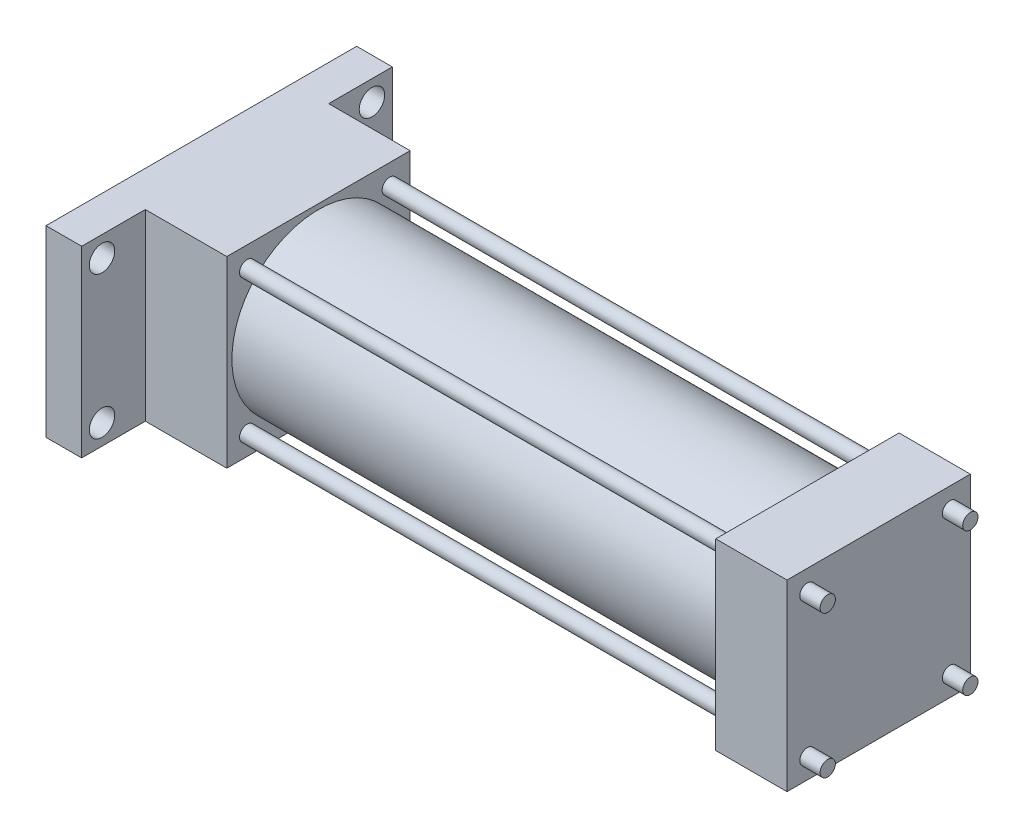
ISO-10303-21;
HEADER;
FILE_DESCRIPTION(('STEP AP214'),'2;1');
FILE_NAME('part.step','',(''),(''),'','','');
FILE_SCHEMA(('AUTOMOTIVE_DESIGN { 1 0 10303 214 1 1 1 1 }'));
ENDSEC;
DATA;
#1=APPLICATION_CONTEXT('core data for automotive mechanical design processes');
#2=APPLICATION_PROTOCOL_DEFINITION('international standard','automotive_design',2000,#1);
#3=PRODUCT_CONTEXT('',#1,'mechanical');
#4=PRODUCT('Part','Part','',(#3));
#5=PRODUCT_RELATED_PRODUCT_CATEGORY('part','',(#4));
#6=PRODUCT_DEFINITION_FORMATION('','',#4);
#7=PRODUCT_DEFINITION_CONTEXT('part definition',#1,'design');
#8=PRODUCT_DEFINITION('design','',#6,#7);
#9=PRODUCT_DEFINITION_SHAPE('','',#8);
#10=(LENGTH_UNIT() NAMED_UNIT(*) SI_UNIT(.MILLI.,.METRE.));
#11=(NAMED_UNIT(*) PLANE_ANGLE_UNIT() SI_UNIT($,.RADIAN.));
#12=(NAMED_UNIT(*) SI_UNIT($,.STERADIAN.) SOLID_ANGLE_UNIT());
#13=UNCERTAINTY_MEASURE_WITH_UNIT(LENGTH_MEASURE(1.E-05),#10,'distance_accuracy_value','');
#14=(GEOMETRIC_REPRESENTATION_CONTEXT(3) GLOBAL_UNCERTAINTY_ASSIGNED_CONTEXT((#13)) GLOBAL_UNIT_ASSIGNED_CONTEXT((#10,
#11,#12)) REPRESENTATION_CONTEXT('',''));
#15=CARTESIAN_POINT('',(0.,0.,0.));
#16=DIRECTION('',(0.,0.,1.));
#17=DIRECTION('',(1.,0.,0.));
#18=AXIS2_PLACEMENT_3D('',#15,#16,#17);
#19=CARTESIAN_POINT('',(-422.275,-57.15,57.1500000000001));
#20=DIRECTION('',(0.,0.,-1.));
#21=DIRECTION('',(0.,1.,0.));
#22=AXIS2_PLACEMENT_3D('',#19,#20,#21);
#23=PLANE('',#22);
#24=DIRECTION('',(0.,1.,0.));
#25=VECTOR('',#24,1.);
#26=CARTESIAN_POINT('',(-400.05,-57.15,57.1500000000001));
#27=LINE('',#26,#25);
#28=CARTESIAN_POINT('',(-400.05,-57.1499999999999,57.15));
#29=VERTEX_POINT('',#28);
#30=CARTESIAN_POINT('',(-400.05,57.15,57.15));
#31=VERTEX_POINT('',#30);
#32=EDGE_CURVE('E174',#29,#31,#27,.T.);
#33=ORIENTED_EDGE('',*,*,#32,.F.);
#34=DIRECTION('',(1.,0.,0.));
#35=VECTOR('',#34,1.);
#36=CARTESIAN_POINT('',(-422.275,-57.15,57.1500000000001));
#37=LINE('',#36,#35);
#38=CARTESIAN_POINT('',(-349.25,-57.15,57.1500000000001));
#39=VERTEX_POINT('',#38);
#40=EDGE_CURVE('E249',#29,#39,#37,.T.);
#41=ORIENTED_EDGE('',*,*,#40,.T.);
#42=DIRECTION('',(0.,1.,0.));
#43=VECTOR('',#42,1.);
#44=CARTESIAN_POINT('',(-349.25,-57.15,57.1500000000001));
#45=LINE('',#44,#43);
#46=CARTESIAN_POINT('',(-349.25,57.15,57.15));
#47=VERTEX_POINT('',#46);
#48=EDGE_CURVE('E238',#39,#47,#45,.T.);
#49=ORIENTED_EDGE('',*,*,#48,.T.);
#50=DIRECTION('',(1.,0.,0.));
#51=VECTOR('',#50,1.);
#52=CARTESIAN_POINT('',(-422.275,57.15,57.15));
#53=LINE('',#52,#51);
#54=EDGE_CURVE('E247',#31,#47,#53,.T.);
#55=ORIENTED_EDGE('',*,*,#54,.F.);
#56=EDGE_LOOP('',(#33,#41,#49,#55));
#57=FACE_BOUND('',#56,.T.);
#58=ADVANCED_FACE('F37',(#57),#23,.F.);
#59=CARTESIAN_POINT('',(-422.275,57.15,-57.15));
#60=DIRECTION('',(0.,0.,1.));
#61=DIRECTION('',(0.,-1.,0.));
#62=AXIS2_PLACEMENT_3D('',#59,#60,#61);
#63=PLANE('',#62);
#64=DIRECTION('',(0.,-1.,0.));
#65=VECTOR('',#64,1.);
#66=CARTESIAN_POINT('',(-400.05,57.15,-57.15));
#67=LINE('',#66,#65);
#68=CARTESIAN_POINT('',(-400.05,57.15,-57.15));
#69=VERTEX_POINT('',#68);
#70=CARTESIAN_POINT('',(-400.05,-57.1499999999999,-57.15));
#71=VERTEX_POINT('',#70);
#72=EDGE_CURVE('E167',#69,#71,#67,.T.);
#73=ORIENTED_EDGE('',*,*,#72,.F.);
#74=DIRECTION('',(1.,0.,0.));
#75=VECTOR('',#74,1.);
#76=CARTESIAN_POINT('',(-422.275,57.15,-57.15));
#77=LINE('',#76,#75);
#78=CARTESIAN_POINT('',(-349.25,57.15,-57.15));
#79=VERTEX_POINT('',#78);
#80=EDGE_CURVE('E145',#69,#79,#77,.T.);
#81=ORIENTED_EDGE('',*,*,#80,.T.);
#82=DIRECTION('',(0.,-1.,0.));
#83=VECTOR('',#82,1.);
#84=CARTESIAN_POINT('',(-349.25,57.15,-57.15));
#85=LINE('',#84,#83);
#86=CARTESIAN_POINT('',(-349.25,-57.15,-57.15));
#87=VERTEX_POINT('',#86);
#88=EDGE_CURVE('E233',#79,#87,#85,.T.);
#89=ORIENTED_EDGE('',*,*,#88,.T.);
#90=DIRECTION('',(1.,0.,0.));
#91=VECTOR('',#90,1.);
#92=CARTESIAN_POINT('',(-422.275,-57.15,-57.15));
#93=LINE('',#92,#91);
#94=EDGE_CURVE('E235',#71,#87,#93,.T.);
#95=ORIENTED_EDGE('',*,*,#94,.F.);
#96=EDGE_LOOP('',(#73,#81,#89,#95));
#97=FACE_BOUND('',#96,.T.);
#98=ADVANCED_FACE('F327',(#97),#63,.F.);
#99=CARTESIAN_POINT('',(-44.45,-57.15,57.1500000000001));
#100=DIRECTION('',(-1.,0.,0.));
#101=DIRECTION('',(0.,0.,1.));
#102=AXIS2_PLACEMENT_3D('',#99,#100,#101);
#103=PLANE('',#102);
#104=CARTESIAN_POINT('',(-44.45,-44.45,44.45));
#105=DIRECTION('',(-1.,0.,0.));
#106=DIRECTION('',(0.,0.,1.));
#107=AXIS2_PLACEMENT_3D('',#104,#105,#106);
#108=CIRCLE('',#107,4.7625);
#109=CARTESIAN_POINT('',(-44.45,-44.45,49.2125));
#110=VERTEX_POINT('',#109);
#111=EDGE_CURVE('E47',#110,#110,#108,.T.);
#112=ORIENTED_EDGE('',*,*,#111,.F.);
#113=EDGE_LOOP('',(#112));
#114=FACE_BOUND('',#113,.T.);
#115=CARTESIAN_POINT('',(-44.45,44.45,44.45));
#116=DIRECTION('',(-1.,0.,0.));
#117=DIRECTION('',(0.,0.,1.));
#118=AXIS2_PLACEMENT_3D('',#115,#116,#117);
#119=CIRCLE('',#118,4.7625);
#120=CARTESIAN_POINT('',(-44.45,44.45,49.2125));
#121=VERTEX_POINT('',#120);
#122=EDGE_CURVE('E213',#121,#121,#119,.F.);
#123=ORIENTED_EDGE('',*,*,#122,.T.);
#124=EDGE_LOOP('',(#123));
#125=FACE_BOUND('',#124,.T.);
#126=DIRECTION('',(0.,-1.,0.));
#127=VECTOR('',#126,1.);
#128=CARTESIAN_POINT('',(-44.45,57.15,57.15));
#129=LINE('',#128,#127);
#130=CARTESIAN_POINT('',(-44.45,57.15,57.15));
#131=VERTEX_POINT('',#130);
#132=CARTESIAN_POINT('',(-44.45,-57.15,57.1500000000001));
#133=VERTEX_POINT('',#132);
#134=EDGE_CURVE('E258',#131,#133,#129,.T.);
#135=ORIENTED_EDGE('',*,*,#134,.F.);
#136=DIRECTION('',(0.,0.,-1.));
#137=VECTOR('',#136,1.);
#138=CARTESIAN_POINT('',(-44.45,57.15,57.15));
#139=LINE('',#138,#137);
#140=CARTESIAN_POINT('',(-44.45,57.15,-57.15));
#141=VERTEX_POINT('',#140);
#142=EDGE_CURVE('E264',#131,#141,#139,.T.);
#143=ORIENTED_EDGE('',*,*,#142,.T.);
#144=DIRECTION('',(0.,1.,0.));
#145=VECTOR('',#144,1.);
#146=CARTESIAN_POINT('',(-44.45,-57.15,-57.15));
#147=LINE('',#146,#145);
#148=CARTESIAN_POINT('',(-44.45,-57.15,-57.15));
#149=VERTEX_POINT('',#148);
#150=EDGE_CURVE('E262',#149,#141,#147,.T.);
#151=ORIENTED_EDGE('',*,*,#150,.F.);
#152=DIRECTION('',(0.,0.,1.));
#153=VECTOR('',#152,1.);
#154=CARTESIAN_POINT('',(-44.45,-57.15,-57.15));
#155=LINE('',#154,#153);
#156=EDGE_CURVE('E85',#149,#133,#155,.T.);
#157=ORIENTED_EDGE('',*,*,#156,.T.);
#158=EDGE_LOOP('',(#135,#143,#151,#157));
#159=FACE_BOUND('',#158,.T.);
#160=CARTESIAN_POINT('',(-44.45,0.,0.));
#161=DIRECTION('',(-1.,0.,0.));
#162=DIRECTION('',(0.,0.,1.));
#163=AXIS2_PLACEMENT_3D('',#160,#161,#162);
#164=CIRCLE('',#163,53.975);
#165=CARTESIAN_POINT('',(-44.45,0.,-53.975));
#166=VERTEX_POINT('',#165);
#167=EDGE_CURVE('E251',#166,#166,#164,.T.);
#168=ORIENTED_EDGE('',*,*,#167,.F.);
#169=EDGE_LOOP('',(#168));
#170=FACE_BOUND('',#169,.T.);
#171=CARTESIAN_POINT('',(-44.45,44.45,-44.45));
#172=DIRECTION('',(-1.,0.,0.));
#173=DIRECTION('',(0.,0.,1.));
#174=AXIS2_PLACEMENT_3D('',#171,#172,#173);
#175=CIRCLE('',#174,4.7625);
#176=CARTESIAN_POINT('',(-44.45,44.45,-39.6875));
#177=VERTEX_POINT('',#176);
#178=EDGE_CURVE('E195',#177,#177,#175,.T.);
#179=ORIENTED_EDGE('',*,*,#178,.F.);
#180=EDGE_LOOP('',(#179));
#181=FACE_BOUND('',#180,.T.);
#182=CARTESIAN_POINT('',(-44.45,-44.45,-44.45));
#183=DIRECTION('',(-1.,0.,0.));
#184=DIRECTION('',(0.,0.,1.));
#185=AXIS2_PLACEMENT_3D('',#182,#183,#184);
#186=CIRCLE('',#185,4.7625);
#187=CARTESIAN_POINT('',(-44.45,-44.45,-39.6875));
#188=VERTEX_POINT('',#187);
#189=EDGE_CURVE('E191',#188,#188,#186,.F.);
#190=ORIENTED_EDGE('',*,*,#189,.T.);
#191=EDGE_LOOP('',(#190));
#192=FACE_BOUND('',#191,.T.);
#193=ADVANCED_FACE('F333',(#114,#125,#159,#170,#181,#192),#103,.T.);
#194=CARTESIAN_POINT('',(0.,-57.15,57.1500000000001));
#195=DIRECTION('',(-1.,0.,0.));
#196=DIRECTION('',(0.,0.,1.));
#197=AXIS2_PLACEMENT_3D('',#194,#195,#196);
#198=PLANE('',#197);
#199=CARTESIAN_POINT('',(0.,-44.45,44.45));
#200=DIRECTION('',(-1.,0.,0.));
#201=DIRECTION('',(0.,0.,1.));
#202=AXIS2_PLACEMENT_3D('',#199,#200,#201);
#203=CIRCLE('',#202,4.7625);
#204=CARTESIAN_POINT('',(0.,-44.45,49.2125));
#205=VERTEX_POINT('',#204);
#206=EDGE_CURVE('E179',#205,#205,#203,.T.);
#207=ORIENTED_EDGE('',*,*,#206,.T.);
#208=EDGE_LOOP('',(#207));
#209=FACE_BOUND('',#208,.T.);
#210=CARTESIAN_POINT('',(0.,44.45,44.45));
#211=DIRECTION('',(-1.,0.,0.));
#212=DIRECTION('',(0.,0.,1.));
#213=AXIS2_PLACEMENT_3D('',#210,#211,#212);
#214=CIRCLE('',#213,4.7625);
#215=CARTESIAN_POINT('',(0.,44.45,49.2125));
#216=VERTEX_POINT('',#215);
#217=EDGE_CURVE('E214',#216,#216,#214,.F.);
#218=ORIENTED_EDGE('',*,*,#217,.F.);
#219=EDGE_LOOP('',(#218));
#220=FACE_BOUND('',#219,.T.);
#221=DIRECTION('',(0.,-1.,0.));
#222=VECTOR('',#221,1.);
#223=CARTESIAN_POINT('',(0.,57.15,57.15));
#224=LINE('',#223,#222);
#225=CARTESIAN_POINT('',(0.,57.15,57.15));
#226=VERTEX_POINT('',#225);
#227=CARTESIAN_POINT('',(0.,-57.15,57.1500000000001));
#228=VERTEX_POINT('',#227);
#229=EDGE_CURVE('E255',#226,#228,#224,.T.);
#230=ORIENTED_EDGE('',*,*,#229,.T.);
#231=DIRECTION('',(0.,0.,1.));
#232=VECTOR('',#231,1.);
#233=CARTESIAN_POINT('',(0.,-57.15,-57.15));
#234=LINE('',#233,#232);
#235=CARTESIAN_POINT('',(0.,-57.15,-57.15));
#236=VERTEX_POINT('',#235);
#237=EDGE_CURVE('E269',#236,#228,#234,.T.);
#238=ORIENTED_EDGE('',*,*,#237,.F.);
#239=DIRECTION('',(0.,1.,0.));
#240=VECTOR('',#239,1.);
#241=CARTESIAN_POINT('',(0.,-57.15,-57.15));
#242=LINE('',#241,#240);
#243=CARTESIAN_POINT('',(0.,57.15,-57.15));
#244=VERTEX_POINT('',#243);
#245=EDGE_CURVE('E272',#236,#244,#242,.T.);
#246=ORIENTED_EDGE('',*,*,#245,.T.);
#247=DIRECTION('',(0.,0.,-1.));
#248=VECTOR('',#247,1.);
#249=CARTESIAN_POINT('',(0.,57.15,57.15));
#250=LINE('',#249,#248);
#251=EDGE_CURVE('E260',#226,#244,#250,.T.);
#252=ORIENTED_EDGE('',*,*,#251,.F.);
#253=EDGE_LOOP('',(#230,#238,#246,#252));
#254=FACE_BOUND('',#253,.T.);
#255=CARTESIAN_POINT('',(0.,44.45,-44.45));
#256=DIRECTION('',(-1.,0.,0.));
#257=DIRECTION('',(0.,0.,1.));
#258=AXIS2_PLACEMENT_3D('',#255,#256,#257);
#259=CIRCLE('',#258,4.7625);
#260=CARTESIAN_POINT('',(0.,44.45,-39.6875));
#261=VERTEX_POINT('',#260);
#262=EDGE_CURVE('E201',#261,#261,#259,.T.);
#263=ORIENTED_EDGE('',*,*,#262,.T.);
#264=EDGE_LOOP('',(#263));
#265=FACE_BOUND('',#264,.T.);
#266=CARTESIAN_POINT('',(0.,-44.45,-44.45));
#267=DIRECTION('',(-1.,0.,0.));
#268=DIRECTION('',(0.,0.,1.));
#269=AXIS2_PLACEMENT_3D('',#266,#267,#268);
#270=CIRCLE('',#269,4.7625);
#271=CARTESIAN_POINT('',(0.,-44.45,-39.6875));
#272=VERTEX_POINT('',#271);
#273=EDGE_CURVE('E192',#272,#272,#270,.F.);
#274=ORIENTED_EDGE('',*,*,#273,.F.);
#275=EDGE_LOOP('',(#274));
#276=FACE_BOUND('',#275,.T.);
#277=ADVANCED_FACE('F294',(#209,#220,#254,#265,#276),#198,.F.);
#278=CARTESIAN_POINT('',(-349.25,-57.15,-57.15));
#279=DIRECTION('',(1.,0.,0.));
#280=DIRECTION('',(0.,0.,-1.));
#281=AXIS2_PLACEMENT_3D('',#278,#279,#280);
#282=PLANE('',#281);
#283=CARTESIAN_POINT('',(-349.25,-44.45,44.45));
#284=DIRECTION('',(1.,0.,0.));
#285=DIRECTION('',(0.,0.,-1.));
#286=AXIS2_PLACEMENT_3D('',#283,#284,#285);
#287=CIRCLE('',#286,4.7625);
#288=CARTESIAN_POINT('',(-349.25,-44.45,39.6875));
#289=VERTEX_POINT('',#288);
#290=EDGE_CURVE('E185',#289,#289,#287,.T.);
#291=ORIENTED_EDGE('',*,*,#290,.F.);
#292=EDGE_LOOP('',(#291));
#293=FACE_BOUND('',#292,.T.);
#294=CARTESIAN_POINT('',(-349.25,44.45,44.45));
#295=DIRECTION('',(1.,0.,0.));
#296=DIRECTION('',(0.,0.,-1.));
#297=AXIS2_PLACEMENT_3D('',#294,#295,#296);
#298=CIRCLE('',#297,4.7625);
#299=CARTESIAN_POINT('',(-349.25,44.45,39.6875));
#300=VERTEX_POINT('',#299);
#301=EDGE_CURVE('E204',#300,#300,#298,.T.);
#302=ORIENTED_EDGE('',*,*,#301,.F.);
#303=EDGE_LOOP('',(#302));
#304=FACE_BOUND('',#303,.T.);
#305=DIRECTION('',(0.,0.,1.));
#306=VECTOR('',#305,1.);
#307=CARTESIAN_POINT('',(-349.25,-57.15,-57.15));
#308=LINE('',#307,#306);
#309=EDGE_CURVE('E229',#87,#39,#308,.T.);
#310=ORIENTED_EDGE('',*,*,#309,.F.);
#311=ORIENTED_EDGE('',*,*,#88,.F.);
#312=DIRECTION('',(0.,0.,-1.));
#313=VECTOR('',#312,1.);
#314=CARTESIAN_POINT('',(-349.25,57.15,57.15));
#315=LINE('',#314,#313);
#316=EDGE_CURVE('E241',#47,#79,#315,.T.);
#317=ORIENTED_EDGE('',*,*,#316,.F.);
#318=ORIENTED_EDGE('',*,*,#48,.F.);
#319=EDGE_LOOP('',(#310,#311,#317,#318));
#320=FACE_BOUND('',#319,.T.);
#321=CARTESIAN_POINT('',(-349.25,0.,0.));
#322=DIRECTION('',(-1.,0.,0.));
#323=DIRECTION('',(0.,0.,1.));
#324=AXIS2_PLACEMENT_3D('',#321,#322,#323);
#325=CIRCLE('',#324,53.975);
#326=CARTESIAN_POINT('',(-349.25,0.,-53.975));
#327=VERTEX_POINT('',#326);
#328=EDGE_CURVE('E252',#327,#327,#325,.T.);
#329=ORIENTED_EDGE('',*,*,#328,.T.);
#330=EDGE_LOOP('',(#329));
#331=FACE_BOUND('',#330,.T.);
#332=CARTESIAN_POINT('',(-349.25,44.45,-44.45));
#333=DIRECTION('',(1.,0.,0.));
#334=DIRECTION('',(0.,0.,-1.));
#335=AXIS2_PLACEMENT_3D('',#332,#333,#334);
#336=CIRCLE('',#335,4.7625);
#337=CARTESIAN_POINT('',(-349.25,44.45,-49.2125));
#338=VERTEX_POINT('',#337);
#339=EDGE_CURVE('E207',#338,#338,#336,.T.);
#340=ORIENTED_EDGE('',*,*,#339,.F.);
#341=EDGE_LOOP('',(#340));
#342=FACE_BOUND('',#341,.T.);
#343=CARTESIAN_POINT('',(-349.25,-44.45,-44.45));
#344=DIRECTION('',(1.,0.,0.));
#345=DIRECTION('',(0.,0.,-1.));
#346=AXIS2_PLACEMENT_3D('',#343,#344,#345);
#347=CIRCLE('',#346,4.7625);
#348=CARTESIAN_POINT('',(-349.25,-44.45,-49.2125));
#349=VERTEX_POINT('',#348);
#350=EDGE_CURVE('E182',#349,#349,#347,.T.);
#351=ORIENTED_EDGE('',*,*,#350,.F.);
#352=EDGE_LOOP('',(#351));
#353=FACE_BOUND('',#352,.T.);
#354=ADVANCED_FACE('F290',(#293,#304,#320,#331,#342,#353),#282,.T.);
#355=CARTESIAN_POINT('',(-422.275,-57.15,-57.15));
#356=DIRECTION('',(1.,0.,0.));
#357=DIRECTION('',(0.,0.,-1.));
#358=AXIS2_PLACEMENT_3D('',#355,#356,#357);
#359=PLANE('',#358);
#360=CARTESIAN_POINT('',(-422.275,44.45,-84.1375));
#361=DIRECTION('',(-1.,0.,0.));
#362=DIRECTION('',(0.,0.,1.));
#363=AXIS2_PLACEMENT_3D('',#360,#361,#362);
#364=CIRCLE('',#363,7.93749999999999);
#365=CARTESIAN_POINT('',(-422.275,44.45,-76.2));
#366=VERTEX_POINT('',#365);
#367=EDGE_CURVE('E417',#366,#366,#364,.T.);
#368=ORIENTED_EDGE('',*,*,#367,.F.);
#369=EDGE_LOOP('',(#368));
#370=FACE_BOUND('',#369,.T.);
#371=CARTESIAN_POINT('',(-422.275,-44.45,-84.1375));
#372=DIRECTION('',(-1.,0.,0.));
#373=DIRECTION('',(0.,0.,1.));
#374=AXIS2_PLACEMENT_3D('',#371,#372,#373);
#375=CIRCLE('',#374,7.93749999999999);
#376=CARTESIAN_POINT('',(-422.275,-44.45,-76.2));
#377=VERTEX_POINT('',#376);
#378=EDGE_CURVE('E421',#377,#377,#375,.T.);
#379=ORIENTED_EDGE('',*,*,#378,.F.);
#380=EDGE_LOOP('',(#379));
#381=FACE_BOUND('',#380,.T.);
#382=CARTESIAN_POINT('',(-422.275,44.45,84.1375));
#383=DIRECTION('',(-1.,0.,0.));
#384=DIRECTION('',(0.,0.,1.));
#385=AXIS2_PLACEMENT_3D('',#382,#383,#384);
#386=CIRCLE('',#385,7.93749999999999);
#387=CARTESIAN_POINT('',(-422.275,44.45,92.075));
#388=VERTEX_POINT('',#387);
#389=EDGE_CURVE('E425',#388,#388,#386,.T.);
#390=ORIENTED_EDGE('',*,*,#389,.F.);
#391=EDGE_LOOP('',(#390));
#392=FACE_BOUND('',#391,.T.);
#393=CARTESIAN_POINT('',(-422.275,-44.45,84.1375));
#394=DIRECTION('',(-1.,0.,0.));
#395=DIRECTION('',(0.,0.,1.));
#396=AXIS2_PLACEMENT_3D('',#393,#394,#395);
#397=CIRCLE('',#396,7.93749999999999);
#398=CARTESIAN_POINT('',(-422.275,-44.45,92.075));
#399=VERTEX_POINT('',#398);
#400=EDGE_CURVE('E429',#399,#399,#397,.T.);
#401=ORIENTED_EDGE('',*,*,#400,.F.);
#402=EDGE_LOOP('',(#401));
#403=FACE_BOUND('',#402,.T.);
#404=DIRECTION('',(0.,0.,1.));
#405=VECTOR('',#404,1.);
#406=CARTESIAN_POINT('',(-422.275,-57.15,-57.15));
#407=LINE('',#406,#405);
#408=CARTESIAN_POINT('',(-422.275,-57.1499999999999,-96.8375));
#409=VERTEX_POINT('',#408);
#410=CARTESIAN_POINT('',(-422.275,-57.1499999999999,96.8375));
#411=VERTEX_POINT('',#410);
#412=EDGE_CURVE('E230',#409,#411,#407,.T.);
#413=ORIENTED_EDGE('',*,*,#412,.T.);
#414=DIRECTION('',(0.,-1.,0.));
#415=VECTOR('',#414,1.);
#416=CARTESIAN_POINT('',(-422.275,57.15,96.8375));
#417=LINE('',#416,#415);
#418=CARTESIAN_POINT('',(-422.275,57.15,96.8375));
#419=VERTEX_POINT('',#418);
#420=EDGE_CURVE('E158',#419,#411,#417,.T.);
#421=ORIENTED_EDGE('',*,*,#420,.F.);
#422=DIRECTION('',(0.,0.,-1.));
#423=VECTOR('',#422,1.);
#424=CARTESIAN_POINT('',(-422.275,57.15,57.15));
#425=LINE('',#424,#423);
#426=CARTESIAN_POINT('',(-422.275,57.15,-96.8375));
#427=VERTEX_POINT('',#426);
#428=EDGE_CURVE('E232',#419,#427,#425,.T.);
#429=ORIENTED_EDGE('',*,*,#428,.T.);
#430=DIRECTION('',(0.,1.,0.));
#431=VECTOR('',#430,1.);
#432=CARTESIAN_POINT('',(-422.275,-57.1499999999999,-96.8375));
#433=LINE('',#432,#431);
#434=EDGE_CURVE('E162',#409,#427,#433,.T.);
#435=ORIENTED_EDGE('',*,*,#434,.F.);
#436=EDGE_LOOP('',(#413,#421,#429,#435));
#437=FACE_BOUND('',#436,.T.);
#438=CARTESIAN_POINT('',(-422.275,0.,0.));
#439=DIRECTION('',(1.,0.,0.));
#440=DIRECTION('',(0.,0.,-1.));
#441=AXIS2_PLACEMENT_3D('',#438,#439,#440);
#442=CIRCLE('',#441,25.4);
#443=CARTESIAN_POINT('',(-422.275,0.,-25.4));
#444=VERTEX_POINT('',#443);
#445=EDGE_CURVE('E217',#444,#444,#442,.F.);
#446=ORIENTED_EDGE('',*,*,#445,.F.);
#447=EDGE_LOOP('',(#446));
#448=FACE_BOUND('',#447,.T.);
#449=ADVANCED_FACE('F293',(#370,#381,#392,#403,#437,#448),#359,.F.);
#450=CARTESIAN_POINT('',(-44.45,57.15,57.15));
#451=DIRECTION('',(0.,0.,1.));
#452=DIRECTION('',(0.,-1.,0.));
#453=AXIS2_PLACEMENT_3D('',#450,#451,#452);
#454=PLANE('',#453);
#455=ORIENTED_EDGE('',*,*,#229,.F.);
#456=DIRECTION('',(1.,0.,0.));
#457=VECTOR('',#456,1.);
#458=CARTESIAN_POINT('',(-44.45,57.15,57.15));
#459=LINE('',#458,#457);
#460=EDGE_CURVE('E55',#131,#226,#459,.T.);
#461=ORIENTED_EDGE('',*,*,#460,.F.);
#462=ORIENTED_EDGE('',*,*,#134,.T.);
#463=DIRECTION('',(1.,0.,0.));
#464=VECTOR('',#463,1.);
#465=CARTESIAN_POINT('',(-44.45,-57.15,57.1500000000001));
#466=LINE('',#465,#464);
#467=EDGE_CURVE('E266',#133,#228,#466,.T.);
#468=ORIENTED_EDGE('',*,*,#467,.T.);
#469=EDGE_LOOP('',(#455,#461,#462,#468));
#470=FACE_BOUND('',#469,.T.);
#471=ADVANCED_FACE('F39',(#470),#454,.T.);
#472=CARTESIAN_POINT('',(-44.45,57.15,57.15));
#473=DIRECTION('',(0.,-1.,0.));
#474=DIRECTION('',(0.,0.,-1.));
#475=AXIS2_PLACEMENT_3D('',#472,#473,#474);
#476=PLANE('',#475);
#477=ORIENTED_EDGE('',*,*,#251,.T.);
#478=DIRECTION('',(1.,0.,0.));
#479=VECTOR('',#478,1.);
#480=CARTESIAN_POINT('',(-44.45,57.15,-57.15));
#481=LINE('',#480,#479);
#482=EDGE_CURVE('E74',#141,#244,#481,.T.);
#483=ORIENTED_EDGE('',*,*,#482,.F.);
#484=ORIENTED_EDGE('',*,*,#142,.F.);
#485=ORIENTED_EDGE('',*,*,#460,.T.);
#486=EDGE_LOOP('',(#477,#483,#484,#485));
#487=FACE_BOUND('',#486,.T.);
#488=ADVANCED_FACE('F354',(#487),#476,.F.);
#489=CARTESIAN_POINT('',(-44.45,-57.15,-57.15));
#490=DIRECTION('',(0.,0.,-1.));
#491=DIRECTION('',(0.,1.,0.));
#492=AXIS2_PLACEMENT_3D('',#489,#490,#491);
#493=PLANE('',#492);
#494=ORIENTED_EDGE('',*,*,#245,.F.);
#495=DIRECTION('',(1.,0.,0.));
#496=VECTOR('',#495,1.);
#497=CARTESIAN_POINT('',(-44.45,-57.15,-57.15));
#498=LINE('',#497,#496);
#499=EDGE_CURVE('E278',#149,#236,#498,.T.);
#500=ORIENTED_EDGE('',*,*,#499,.F.);
#501=ORIENTED_EDGE('',*,*,#150,.T.);
#502=ORIENTED_EDGE('',*,*,#482,.T.);
#503=EDGE_LOOP('',(#494,#500,#501,#502));
#504=FACE_BOUND('',#503,.T.);
#505=ADVANCED_FACE('F357',(#504),#493,.T.);
#506=CARTESIAN_POINT('',(-44.45,-57.15,-57.15));
#507=DIRECTION('',(0.,1.,0.));
#508=DIRECTION('',(0.,0.,1.));
#509=AXIS2_PLACEMENT_3D('',#506,#507,#508);
#510=PLANE('',#509);
#511=ORIENTED_EDGE('',*,*,#237,.T.);
#512=ORIENTED_EDGE('',*,*,#467,.F.);
#513=ORIENTED_EDGE('',*,*,#156,.F.);
#514=ORIENTED_EDGE('',*,*,#499,.T.);
#515=EDGE_LOOP('',(#511,#512,#513,#514));
#516=FACE_BOUND('',#515,.T.);
#517=ADVANCED_FACE('F346',(#516),#510,.F.);
#518=CARTESIAN_POINT('',(-349.25,0.,0.));
#519=DIRECTION('',(1.,0.,0.));
#520=DIRECTION('',(0.,0.,-1.));
#521=AXIS2_PLACEMENT_3D('',#518,#519,#520);
#522=CYLINDRICAL_SURFACE('',#521,53.975);
#523=CARTESIAN_POINT('',(-349.25,0.,-53.975));
#524=CARTESIAN_POINT('',(-346.075,0.,-53.975));
#525=CARTESIAN_POINT('',(-342.9,0.,-53.975));
#526=CARTESIAN_POINT('',(-336.55,0.,-53.975));
#527=CARTESIAN_POINT('',(-333.375,0.,-53.975));
#528=CARTESIAN_POINT('',(-327.025,0.,-53.975));
#529=CARTESIAN_POINT('',(-323.85,0.,-53.975));
#530=CARTESIAN_POINT('',(-317.5,0.,-53.975));
#531=CARTESIAN_POINT('',(-314.325,0.,-53.975));
#532=CARTESIAN_POINT('',(-307.975,0.,-53.975));
#533=CARTESIAN_POINT('',(-304.8,0.,-53.975));
#534=CARTESIAN_POINT('',(-298.45,0.,-53.975));
#535=CARTESIAN_POINT('',(-295.275,0.,-53.975));
#536=CARTESIAN_POINT('',(-288.925,0.,-53.975));
#537=CARTESIAN_POINT('',(-285.75,0.,-53.975));
#538=CARTESIAN_POINT('',(-279.4,0.,-53.975));
#539=CARTESIAN_POINT('',(-276.225,0.,-53.975));
#540=CARTESIAN_POINT('',(-269.875,0.,-53.975));
#541=CARTESIAN_POINT('',(-266.7,0.,-53.975));
#542=CARTESIAN_POINT('',(-260.35,0.,-53.975));
#543=CARTESIAN_POINT('',(-257.175,0.,-53.975));
#544=CARTESIAN_POINT('',(-250.825,0.,-53.975));
#545=CARTESIAN_POINT('',(-247.65,0.,-53.975));
#546=CARTESIAN_POINT('',(-241.3,0.,-53.975));
#547=CARTESIAN_POINT('',(-238.125,0.,-53.975));
#548=CARTESIAN_POINT('',(-231.775,0.,-53.975));
#549=CARTESIAN_POINT('',(-228.6,0.,-53.975));
#550=CARTESIAN_POINT('',(-222.25,0.,-53.975));
#551=CARTESIAN_POINT('',(-219.075,0.,-53.975));
#552=CARTESIAN_POINT('',(-212.725,0.,-53.975));
#553=CARTESIAN_POINT('',(-209.55,0.,-53.975));
#554=CARTESIAN_POINT('',(-203.2,0.,-53.975));
#555=CARTESIAN_POINT('',(-200.025,0.,-53.975));
#556=CARTESIAN_POINT('',(-193.675,0.,-53.975));
#557=CARTESIAN_POINT('',(-190.5,0.,-53.975));
#558=CARTESIAN_POINT('',(-184.15,0.,-53.975));
#559=CARTESIAN_POINT('',(-180.975,0.,-53.975));
#560=CARTESIAN_POINT('',(-174.625,0.,-53.975));
#561=CARTESIAN_POINT('',(-171.45,0.,-53.975));
#562=CARTESIAN_POINT('',(-165.1,0.,-53.975));
#563=CARTESIAN_POINT('',(-161.925,0.,-53.975));
#564=CARTESIAN_POINT('',(-155.575,0.,-53.975));
#565=CARTESIAN_POINT('',(-152.4,0.,-53.975));
#566=CARTESIAN_POINT('',(-146.05,0.,-53.975));
#567=CARTESIAN_POINT('',(-142.875,0.,-53.975));
#568=CARTESIAN_POINT('',(-136.525,0.,-53.975));
#569=CARTESIAN_POINT('',(-133.35,0.,-53.975));
#570=CARTESIAN_POINT('',(-127.,0.,-53.975));
#571=CARTESIAN_POINT('',(-123.825,0.,-53.975));
#572=CARTESIAN_POINT('',(-117.475,0.,-53.975));
#573=CARTESIAN_POINT('',(-114.3,0.,-53.975));
#574=CARTESIAN_POINT('',(-107.95,0.,-53.975));
#575=CARTESIAN_POINT('',(-104.775,0.,-53.975));
#576=CARTESIAN_POINT('',(-98.425,0.,-53.975));
#577=CARTESIAN_POINT('',(-95.25,0.,-53.975));
#578=CARTESIAN_POINT('',(-88.9,0.,-53.975));
#579=CARTESIAN_POINT('',(-85.725,0.,-53.975));
#580=CARTESIAN_POINT('',(-79.375,0.,-53.975));
#581=CARTESIAN_POINT('',(-76.2,0.,-53.975));
#582=CARTESIAN_POINT('',(-69.85,0.,-53.975));
#583=CARTESIAN_POINT('',(-66.675,0.,-53.975));
#584=CARTESIAN_POINT('',(-60.325,0.,-53.975));
#585=CARTESIAN_POINT('',(-57.15,0.,-53.975));
#586=CARTESIAN_POINT('',(-50.8,0.,-53.975));
#587=CARTESIAN_POINT('',(-47.625,0.,-53.975));
#588=CARTESIAN_POINT('',(-44.45,0.,-53.975));
#589=B_SPLINE_CURVE_WITH_KNOTS('',3,(#523,#524,#525,#526,#527,#528,#529,#530,#531,#532,#533,
#534,#535,#536,#537,#538,#539,#540,#541,#542,#543,#544,#545,#546,#547,#548,#549,#550,#551,#552,
#553,#554,#555,#556,#557,#558,#559,#560,#561,#562,#563,#564,#565,#566,#567,#568,#569,#570,#571,
#572,#573,#574,#575,#576,#577,#578,#579,#580,#581,#582,#583,#584,#585,#586,#587,#588),
.UNSPECIFIED.,.F.,.F.,(4,2,2,2,2,2,2,2,2,2,2,2,2,2,2,2,2,2,2,2,2,2,2,2,2,2,2,2,2,2,2,2,4),(0.,
9.52500000000001,19.05,28.575,38.1,47.625,57.15,66.675,76.2,85.7250000000001,95.2500000000001,
104.775,114.3,123.825,133.35,142.875,152.4,161.925,171.45,180.975,190.5,200.025,209.55,219.075,
228.6,238.125,247.65,257.175,266.7,276.225,285.75,295.275,304.8),.UNSPECIFIED.);
#590=EDGE_CURVE('BSEAM342',#327,#166,#589,.T.);
#591=ORIENTED_EDGE('',*,*,#328,.F.);
#592=ORIENTED_EDGE('',*,*,#167,.T.);
#593=ORIENTED_EDGE('',*,*,#590,.T.);
#594=ORIENTED_EDGE('',*,*,#590,.F.);
#595=EDGE_LOOP('',(#591,#593,#592,#594));
#596=FACE_BOUND('',#595,.T.);
#597=ADVANCED_FACE('F342',(#596),#522,.T.);
#598=CARTESIAN_POINT('',(-422.275,-57.15,-57.15));
#599=DIRECTION('',(0.,1.,0.));
#600=DIRECTION('',(0.,0.,1.));
#601=AXIS2_PLACEMENT_3D('',#598,#599,#600);
#602=PLANE('',#601);
#603=ORIENTED_EDGE('',*,*,#412,.F.);
#604=DIRECTION('',(-1.,0.,0.));
#605=VECTOR('',#604,1.);
#606=CARTESIAN_POINT('',(-400.05,-57.1499999999999,-96.8375));
#607=LINE('',#606,#605);
#608=CARTESIAN_POINT('',(-400.05,-57.1499999999999,-96.8375));
#609=VERTEX_POINT('',#608);
#610=EDGE_CURVE('E442',#609,#409,#607,.T.);
#611=ORIENTED_EDGE('',*,*,#610,.F.);
#612=DIRECTION('',(0.,0.,1.));
#613=VECTOR('',#612,1.);
#614=CARTESIAN_POINT('',(-400.05,-57.1499999999999,-96.8375));
#615=LINE('',#614,#613);
#616=EDGE_CURVE('E155',#609,#71,#615,.T.);
#617=ORIENTED_EDGE('',*,*,#616,.T.);
#618=ORIENTED_EDGE('',*,*,#94,.T.);
#619=ORIENTED_EDGE('',*,*,#309,.T.);
#620=ORIENTED_EDGE('',*,*,#40,.F.);
#621=CARTESIAN_POINT('',(-400.05,-57.1499999999999,96.8375));
#622=VERTEX_POINT('',#621);
#623=EDGE_CURVE('E438',#29,#622,#615,.T.);
#624=ORIENTED_EDGE('',*,*,#623,.T.);
#625=DIRECTION('',(-1.,0.,0.));
#626=VECTOR('',#625,1.);
#627=CARTESIAN_POINT('',(-400.05,-57.1499999999999,96.8375));
#628=LINE('',#627,#626);
#629=EDGE_CURVE('E169',#622,#411,#628,.T.);
#630=ORIENTED_EDGE('',*,*,#629,.T.);
#631=EDGE_LOOP('',(#603,#611,#617,#618,#619,#620,#624,#630));
#632=FACE_BOUND('',#631,.T.);
#633=ADVANCED_FACE('F339',(#632),#602,.F.);
#634=CARTESIAN_POINT('',(-422.275,57.15,57.15));
#635=DIRECTION('',(0.,-1.,0.));
#636=DIRECTION('',(0.,0.,-1.));
#637=AXIS2_PLACEMENT_3D('',#634,#635,#636);
#638=PLANE('',#637);
#639=ORIENTED_EDGE('',*,*,#428,.F.);
#640=DIRECTION('',(-1.,0.,0.));
#641=VECTOR('',#640,1.);
#642=CARTESIAN_POINT('',(-400.05,57.15,96.8375));
#643=LINE('',#642,#641);
#644=CARTESIAN_POINT('',(-400.05,57.15,96.8375));
#645=VERTEX_POINT('',#644);
#646=EDGE_CURVE('E164',#645,#419,#643,.T.);
#647=ORIENTED_EDGE('',*,*,#646,.F.);
#648=DIRECTION('',(0.,0.,-1.));
#649=VECTOR('',#648,1.);
#650=CARTESIAN_POINT('',(-400.05,57.15,96.8375));
#651=LINE('',#650,#649);
#652=EDGE_CURVE('E148',#645,#31,#651,.T.);
#653=ORIENTED_EDGE('',*,*,#652,.T.);
#654=ORIENTED_EDGE('',*,*,#54,.T.);
#655=ORIENTED_EDGE('',*,*,#316,.T.);
#656=ORIENTED_EDGE('',*,*,#80,.F.);
#657=CARTESIAN_POINT('',(-400.05,57.15,-96.8375));
#658=VERTEX_POINT('',#657);
#659=EDGE_CURVE('E138',#69,#658,#651,.T.);
#660=ORIENTED_EDGE('',*,*,#659,.T.);
#661=DIRECTION('',(-1.,0.,0.));
#662=VECTOR('',#661,1.);
#663=CARTESIAN_POINT('',(-400.05,57.15,-96.8375));
#664=LINE('',#663,#662);
#665=EDGE_CURVE('E142',#658,#427,#664,.T.);
#666=ORIENTED_EDGE('',*,*,#665,.T.);
#667=EDGE_LOOP('',(#639,#647,#653,#654,#655,#656,#660,#666));
#668=FACE_BOUND('',#667,.T.);
#669=ADVANCED_FACE('F140',(#668),#638,.F.);
#670=CARTESIAN_POINT('',(-447.675,0.,0.));
#671=DIRECTION('',(1.,0.,0.));
#672=DIRECTION('',(0.,0.,-1.));
#673=AXIS2_PLACEMENT_3D('',#670,#671,#672);
#674=CYLINDRICAL_SURFACE('',#673,25.4);
#675=CARTESIAN_POINT('',(-447.675,0.,0.));
#676=DIRECTION('',(-1.,0.,0.));
#677=DIRECTION('',(0.,0.,1.));
#678=AXIS2_PLACEMENT_3D('',#675,#676,#677);
#679=CIRCLE('',#678,25.4);
#680=CARTESIAN_POINT('',(-447.675,0.,25.4));
#681=VERTEX_POINT('',#680);
#682=EDGE_CURVE('E226',#681,#681,#679,.T.);
#683=ORIENTED_EDGE('',*,*,#682,.F.);
#684=EDGE_LOOP('',(#683));
#685=FACE_BOUND('',#684,.T.);
#686=ORIENTED_EDGE('',*,*,#445,.T.);
#687=EDGE_LOOP('',(#686));
#688=FACE_BOUND('',#687,.T.);
#689=ADVANCED_FACE('F404',(#685,#688),#674,.T.);
#690=CARTESIAN_POINT('',(-447.675,0.,0.));
#691=DIRECTION('',(-1.,0.,0.));
#692=DIRECTION('',(0.,0.,1.));
#693=AXIS2_PLACEMENT_3D('',#690,#691,#692);
#694=PLANE('',#693);
#695=CARTESIAN_POINT('',(-447.675,0.,0.));
#696=DIRECTION('',(-1.,0.,0.));
#697=DIRECTION('',(0.,0.,1.));
#698=AXIS2_PLACEMENT_3D('',#695,#696,#697);
#699=CIRCLE('',#698,17.4625);
#700=CARTESIAN_POINT('',(-447.675,0.,17.4625));
#701=VERTEX_POINT('',#700);
#702=EDGE_CURVE('E220',#701,#701,#699,.T.);
#703=ORIENTED_EDGE('',*,*,#702,.F.);
#704=EDGE_LOOP('',(#703));
#705=FACE_BOUND('',#704,.T.);
#706=ORIENTED_EDGE('',*,*,#682,.T.);
#707=EDGE_LOOP('',(#706));
#708=FACE_BOUND('',#707,.T.);
#709=ADVANCED_FACE('F400',(#705,#708),#694,.T.);
#710=CARTESIAN_POINT('',(4.94140866588033,0.,0.));
#711=DIRECTION('',(-1.,0.,0.));
#712=DIRECTION('',(0.,0.,1.));
#713=AXIS2_PLACEMENT_3D('',#710,#711,#712);
#714=CYLINDRICAL_SURFACE('',#713,17.4625);
#715=CARTESIAN_POINT('',(-422.275,0.,0.));
#716=DIRECTION('',(-1.,0.,0.));
#717=DIRECTION('',(0.,0.,1.));
#718=AXIS2_PLACEMENT_3D('',#715,#716,#717);
#719=CIRCLE('',#718,17.4625);
#720=CARTESIAN_POINT('',(-422.275,0.,17.4625));
#721=VERTEX_POINT('',#720);
#722=EDGE_CURVE('E163',#721,#721,#719,.F.);
#723=ORIENTED_EDGE('',*,*,#722,.T.);
#724=EDGE_LOOP('',(#723));
#725=FACE_BOUND('',#724,.T.);
#726=ORIENTED_EDGE('',*,*,#702,.T.);
#727=EDGE_LOOP('',(#726));
#728=FACE_BOUND('',#727,.T.);
#729=ADVANCED_FACE('F388',(#725,#728),#714,.F.);
#730=CARTESIAN_POINT('',(26.1703841816037,44.45,44.45));
#731=DIRECTION('',(-1.,0.,0.));
#732=DIRECTION('',(0.,0.,1.));
#733=AXIS2_PLACEMENT_3D('',#730,#731,#732);
#734=CYLINDRICAL_SURFACE('',#733,4.7625);
#735=ORIENTED_EDGE('',*,*,#122,.F.);
#736=EDGE_LOOP('',(#735));
#737=FACE_BOUND('',#736,.T.);
#738=ORIENTED_EDGE('',*,*,#301,.T.);
#739=EDGE_LOOP('',(#738));
#740=FACE_BOUND('',#739,.T.);
#741=ADVANCED_FACE('F386',(#737,#740),#734,.T.);
#742=CARTESIAN_POINT('',(12.7,44.45,44.45));
#743=DIRECTION('',(1.,0.,0.));
#744=DIRECTION('',(0.,0.,-1.));
#745=AXIS2_PLACEMENT_3D('',#742,#743,#744);
#746=CIRCLE('',#745,4.7625);
#747=CARTESIAN_POINT('',(12.7,44.45,39.6875));
#748=VERTEX_POINT('',#747);
#749=EDGE_CURVE('E210',#748,#748,#746,.T.);
#750=ORIENTED_EDGE('',*,*,#749,.F.);
#751=EDGE_LOOP('',(#750));
#752=FACE_BOUND('',#751,.T.);
#753=ORIENTED_EDGE('',*,*,#217,.T.);
#754=EDGE_LOOP('',(#753));
#755=FACE_BOUND('',#754,.T.);
#756=ADVANCED_FACE('F382',(#752,#755),#734,.T.);
#757=CARTESIAN_POINT('',(12.7,-57.15,57.1500000000001));
#758=DIRECTION('',(1.,0.,0.));
#759=DIRECTION('',(0.,0.,-1.));
#760=AXIS2_PLACEMENT_3D('',#757,#758,#759);
#761=PLANE('',#760);
#762=ORIENTED_EDGE('',*,*,#749,.T.);
#763=EDGE_LOOP('',(#762));
#764=FACE_BOUND('',#763,.T.);
#765=ADVANCED_FACE('F375',(#764),#761,.T.);
#766=CARTESIAN_POINT('',(26.1703841816037,44.45,-44.45));
#767=DIRECTION('',(-1.,0.,0.));
#768=DIRECTION('',(0.,0.,1.));
#769=AXIS2_PLACEMENT_3D('',#766,#767,#768);
#770=CYLINDRICAL_SURFACE('',#769,4.7625);
#771=ORIENTED_EDGE('',*,*,#178,.T.);
#772=EDGE_LOOP('',(#771));
#773=FACE_BOUND('',#772,.T.);
#774=ORIENTED_EDGE('',*,*,#339,.T.);
#775=EDGE_LOOP('',(#774));
#776=FACE_BOUND('',#775,.T.);
#777=ADVANCED_FACE('F372',(#773,#776),#770,.T.);
#778=CARTESIAN_POINT('',(12.7,44.45,-44.45));
#779=DIRECTION('',(1.,0.,0.));
#780=DIRECTION('',(0.,0.,-1.));
#781=AXIS2_PLACEMENT_3D('',#778,#779,#780);
#782=CIRCLE('',#781,4.7625);
#783=CARTESIAN_POINT('',(12.7,44.45,-49.2125));
#784=VERTEX_POINT('',#783);
#785=EDGE_CURVE('E198',#784,#784,#782,.F.);
#786=ORIENTED_EDGE('',*,*,#785,.T.);
#787=EDGE_LOOP('',(#786));
#788=FACE_BOUND('',#787,.T.);
#789=ORIENTED_EDGE('',*,*,#262,.F.);
#790=EDGE_LOOP('',(#789));
#791=FACE_BOUND('',#790,.T.);
#792=ADVANCED_FACE('F320',(#788,#791),#770,.T.);
#793=CARTESIAN_POINT('',(12.7,-57.15,57.1500000000001));
#794=DIRECTION('',(1.,0.,0.));
#795=DIRECTION('',(0.,0.,-1.));
#796=AXIS2_PLACEMENT_3D('',#793,#794,#795);
#797=PLANE('',#796);
#798=ORIENTED_EDGE('',*,*,#785,.F.);
#799=EDGE_LOOP('',(#798));
#800=FACE_BOUND('',#799,.T.);
#801=ADVANCED_FACE('F311',(#800),#797,.T.);
#802=CARTESIAN_POINT('',(26.1703841816037,-44.45,-44.45));
#803=DIRECTION('',(-1.,0.,0.));
#804=DIRECTION('',(0.,0.,1.));
#805=AXIS2_PLACEMENT_3D('',#802,#803,#804);
#806=CYLINDRICAL_SURFACE('',#805,4.7625);
#807=ORIENTED_EDGE('',*,*,#189,.F.);
#808=EDGE_LOOP('',(#807));
#809=FACE_BOUND('',#808,.T.);
#810=ORIENTED_EDGE('',*,*,#350,.T.);
#811=EDGE_LOOP('',(#810));
#812=FACE_BOUND('',#811,.T.);
#813=ADVANCED_FACE('F308',(#809,#812),#806,.T.);
#814=CARTESIAN_POINT('',(12.7,-44.45,-44.45));
#815=DIRECTION('',(1.,0.,0.));
#816=DIRECTION('',(0.,0.,-1.));
#817=AXIS2_PLACEMENT_3D('',#814,#815,#816);
#818=CIRCLE('',#817,4.7625);
#819=CARTESIAN_POINT('',(12.7,-44.45,-49.2125));
#820=VERTEX_POINT('',#819);
#821=EDGE_CURVE('E188',#820,#820,#818,.T.);
#822=ORIENTED_EDGE('',*,*,#821,.F.);
#823=EDGE_LOOP('',(#822));
#824=FACE_BOUND('',#823,.T.);
#825=ORIENTED_EDGE('',*,*,#273,.T.);
#826=EDGE_LOOP('',(#825));
#827=FACE_BOUND('',#826,.T.);
#828=ADVANCED_FACE('F310',(#824,#827),#806,.T.);
#829=CARTESIAN_POINT('',(12.7,-57.15,57.1500000000001));
#830=DIRECTION('',(1.,0.,0.));
#831=DIRECTION('',(0.,0.,-1.));
#832=AXIS2_PLACEMENT_3D('',#829,#830,#831);
#833=PLANE('',#832);
#834=ORIENTED_EDGE('',*,*,#821,.T.);
#835=EDGE_LOOP('',(#834));
#836=FACE_BOUND('',#835,.T.);
#837=ADVANCED_FACE('F318',(#836),#833,.T.);
#838=CARTESIAN_POINT('',(26.1703841816037,-44.45,44.45));
#839=DIRECTION('',(-1.,0.,0.));
#840=DIRECTION('',(0.,0.,1.));
#841=AXIS2_PLACEMENT_3D('',#838,#839,#840);
#842=CYLINDRICAL_SURFACE('',#841,4.7625);
#843=ORIENTED_EDGE('',*,*,#111,.T.);
#844=EDGE_LOOP('',(#843));
#845=FACE_BOUND('',#844,.T.);
#846=ORIENTED_EDGE('',*,*,#290,.T.);
#847=EDGE_LOOP('',(#846));
#848=FACE_BOUND('',#847,.T.);
#849=ADVANCED_FACE('F288',(#845,#848),#842,.T.);
#850=CARTESIAN_POINT('',(12.7,-44.45,44.45));
#851=DIRECTION('',(1.,0.,0.));
#852=DIRECTION('',(0.,0.,-1.));
#853=AXIS2_PLACEMENT_3D('',#850,#851,#852);
#854=CIRCLE('',#853,4.7625);
#855=CARTESIAN_POINT('',(12.7,-44.45,39.6875));
#856=VERTEX_POINT('',#855);
#857=EDGE_CURVE('E176',#856,#856,#854,.F.);
#858=ORIENTED_EDGE('',*,*,#857,.T.);
#859=EDGE_LOOP('',(#858));
#860=FACE_BOUND('',#859,.T.);
#861=ORIENTED_EDGE('',*,*,#206,.F.);
#862=EDGE_LOOP('',(#861));
#863=FACE_BOUND('',#862,.T.);
#864=ADVANCED_FACE('F508',(#860,#863),#842,.T.);
#865=CARTESIAN_POINT('',(12.7,-57.15,57.1500000000001));
#866=DIRECTION('',(1.,0.,0.));
#867=DIRECTION('',(0.,0.,-1.));
#868=AXIS2_PLACEMENT_3D('',#865,#866,#867);
#869=PLANE('',#868);
#870=ORIENTED_EDGE('',*,*,#857,.F.);
#871=EDGE_LOOP('',(#870));
#872=FACE_BOUND('',#871,.T.);
#873=ADVANCED_FACE('F501',(#872),#869,.T.);
#874=CARTESIAN_POINT('',(-422.275,57.15,-96.8375));
#875=DIRECTION('',(-1.,0.,0.));
#876=DIRECTION('',(0.,0.,1.));
#877=AXIS2_PLACEMENT_3D('',#874,#875,#876);
#878=PLANE('',#877);
#879=ORIENTED_EDGE('',*,*,#722,.F.);
#880=EDGE_LOOP('',(#879));
#881=FACE_BOUND('',#880,.T.);
#882=ADVANCED_FACE('F498',(#881),#878,.T.);
#883=CARTESIAN_POINT('',(-400.05,-57.1499999999999,-96.8375));
#884=DIRECTION('',(0.,0.,1.));
#885=DIRECTION('',(1.,0.,0.));
#886=AXIS2_PLACEMENT_3D('',#883,#884,#885);
#887=PLANE('',#886);
#888=ORIENTED_EDGE('',*,*,#434,.T.);
#889=ORIENTED_EDGE('',*,*,#665,.F.);
#890=DIRECTION('',(0.,1.,0.));
#891=VECTOR('',#890,1.);
#892=CARTESIAN_POINT('',(-400.05,-57.1499999999999,-96.8375));
#893=LINE('',#892,#891);
#894=EDGE_CURVE('E149',#609,#658,#893,.T.);
#895=ORIENTED_EDGE('',*,*,#894,.F.);
#896=ORIENTED_EDGE('',*,*,#610,.T.);
#897=EDGE_LOOP('',(#888,#889,#895,#896));
#898=FACE_BOUND('',#897,.T.);
#899=ADVANCED_FACE('F160',(#898),#887,.F.);
#900=CARTESIAN_POINT('',(-400.05,57.15,-96.8375));
#901=DIRECTION('',(-1.,0.,0.));
#902=DIRECTION('',(0.,0.,1.));
#903=AXIS2_PLACEMENT_3D('',#900,#901,#902);
#904=PLANE('',#903);
#905=CARTESIAN_POINT('',(-400.05,44.45,-84.1375));
#906=DIRECTION('',(-1.,0.,0.));
#907=DIRECTION('',(0.,0.,1.));
#908=AXIS2_PLACEMENT_3D('',#905,#906,#907);
#909=CIRCLE('',#908,7.93749999999999);
#910=CARTESIAN_POINT('',(-400.05,44.45,-76.2));
#911=VERTEX_POINT('',#910);
#912=EDGE_CURVE('E465',#911,#911,#909,.F.);
#913=ORIENTED_EDGE('',*,*,#912,.F.);
#914=EDGE_LOOP('',(#913));
#915=FACE_BOUND('',#914,.T.);
#916=CARTESIAN_POINT('',(-400.05,-44.45,-84.1375));
#917=DIRECTION('',(-1.,0.,0.));
#918=DIRECTION('',(0.,0.,1.));
#919=AXIS2_PLACEMENT_3D('',#916,#917,#918);
#920=CIRCLE('',#919,7.93749999999999);
#921=CARTESIAN_POINT('',(-400.05,-44.45,-76.2));
#922=VERTEX_POINT('',#921);
#923=EDGE_CURVE('E461',#922,#922,#920,.F.);
#924=ORIENTED_EDGE('',*,*,#923,.F.);
#925=EDGE_LOOP('',(#924));
#926=FACE_BOUND('',#925,.T.);
#927=ORIENTED_EDGE('',*,*,#659,.F.);
#928=ORIENTED_EDGE('',*,*,#72,.T.);
#929=ORIENTED_EDGE('',*,*,#616,.F.);
#930=ORIENTED_EDGE('',*,*,#894,.T.);
#931=EDGE_LOOP('',(#927,#928,#929,#930));
#932=FACE_BOUND('',#931,.T.);
#933=ADVANCED_FACE('F153',(#915,#926,#932),#904,.F.);
#934=CARTESIAN_POINT('',(-400.05,44.45,84.1375));
#935=DIRECTION('',(-1.,0.,0.));
#936=DIRECTION('',(0.,0.,1.));
#937=AXIS2_PLACEMENT_3D('',#934,#935,#936);
#938=CIRCLE('',#937,7.93749999999999);
#939=CARTESIAN_POINT('',(-400.05,44.45,92.075));
#940=VERTEX_POINT('',#939);
#941=EDGE_CURVE('E457',#940,#940,#938,.F.);
#942=ORIENTED_EDGE('',*,*,#941,.F.);
#943=EDGE_LOOP('',(#942));
#944=FACE_BOUND('',#943,.T.);
#945=CARTESIAN_POINT('',(-400.05,-44.45,84.1375));
#946=DIRECTION('',(-1.,0.,0.));
#947=DIRECTION('',(0.,0.,1.));
#948=AXIS2_PLACEMENT_3D('',#945,#946,#947);
#949=CIRCLE('',#948,7.93749999999999);
#950=CARTESIAN_POINT('',(-400.05,-44.45,92.075));
#951=VERTEX_POINT('',#950);
#952=EDGE_CURVE('E445',#951,#951,#949,.F.);
#953=ORIENTED_EDGE('',*,*,#952,.F.);
#954=EDGE_LOOP('',(#953));
#955=FACE_BOUND('',#954,.T.);
#956=ORIENTED_EDGE('',*,*,#623,.F.);
#957=ORIENTED_EDGE('',*,*,#32,.T.);
#958=ORIENTED_EDGE('',*,*,#652,.F.);
#959=DIRECTION('',(0.,-1.,0.));
#960=VECTOR('',#959,1.);
#961=CARTESIAN_POINT('',(-400.05,57.15,96.8375));
#962=LINE('',#961,#960);
#963=EDGE_CURVE('E450',#645,#622,#962,.T.);
#964=ORIENTED_EDGE('',*,*,#963,.T.);
#965=EDGE_LOOP('',(#956,#957,#958,#964));
#966=FACE_BOUND('',#965,.T.);
#967=ADVANCED_FACE('F478',(#944,#955,#966),#904,.F.);
#968=CARTESIAN_POINT('',(-400.05,57.15,96.8375));
#969=DIRECTION('',(0.,0.,-1.));
#970=DIRECTION('',(-1.,0.,0.));
#971=AXIS2_PLACEMENT_3D('',#968,#969,#970);
#972=PLANE('',#971);
#973=ORIENTED_EDGE('',*,*,#420,.T.);
#974=ORIENTED_EDGE('',*,*,#629,.F.);
#975=ORIENTED_EDGE('',*,*,#963,.F.);
#976=ORIENTED_EDGE('',*,*,#646,.T.);
#977=EDGE_LOOP('',(#973,#974,#975,#976));
#978=FACE_BOUND('',#977,.T.);
#979=ADVANCED_FACE('F443',(#978),#972,.F.);
#980=CARTESIAN_POINT('',(12.701,-44.45,84.1375));
#981=DIRECTION('',(-1.,0.,0.));
#982=DIRECTION('',(0.,0.,1.));
#983=AXIS2_PLACEMENT_3D('',#980,#981,#982);
#984=CYLINDRICAL_SURFACE('',#983,7.93749999999999);
#985=ORIENTED_EDGE('',*,*,#400,.T.);
#986=EDGE_LOOP('',(#985));
#987=FACE_BOUND('',#986,.T.);
#988=ORIENTED_EDGE('',*,*,#952,.T.);
#989=EDGE_LOOP('',(#988));
#990=FACE_BOUND('',#989,.T.);
#991=ADVANCED_FACE('F489',(#987,#990),#984,.F.);
#992=CARTESIAN_POINT('',(12.701,44.45,84.1375));
#993=DIRECTION('',(-1.,0.,0.));
#994=DIRECTION('',(0.,0.,1.));
#995=AXIS2_PLACEMENT_3D('',#992,#993,#994);
#996=CYLINDRICAL_SURFACE('',#995,7.93749999999999);
#997=ORIENTED_EDGE('',*,*,#389,.T.);
#998=EDGE_LOOP('',(#997));
#999=FACE_BOUND('',#998,.T.);
#1000=ORIENTED_EDGE('',*,*,#941,.T.);
#1001=EDGE_LOOP('',(#1000));
#1002=FACE_BOUND('',#1001,.T.);
#1003=ADVANCED_FACE('F483',(#999,#1002),#996,.F.);
#1004=CARTESIAN_POINT('',(12.701,-44.45,-84.1375));
#1005=DIRECTION('',(-1.,0.,0.));
#1006=DIRECTION('',(0.,0.,1.));
#1007=AXIS2_PLACEMENT_3D('',#1004,#1005,#1006);
#1008=CYLINDRICAL_SURFACE('',#1007,7.93749999999999);
#1009=ORIENTED_EDGE('',*,*,#378,.T.);
#1010=EDGE_LOOP('',(#1009));
#1011=FACE_BOUND('',#1010,.T.);
#1012=ORIENTED_EDGE('',*,*,#923,.T.);
#1013=EDGE_LOOP('',(#1012));
#1014=FACE_BOUND('',#1013,.T.);
#1015=ADVANCED_FACE('F472',(#1011,#1014),#1008,.F.);
#1016=CARTESIAN_POINT('',(12.701,44.45,-84.1375));
#1017=DIRECTION('',(-1.,0.,0.));
#1018=DIRECTION('',(0.,0.,1.));
#1019=AXIS2_PLACEMENT_3D('',#1016,#1017,#1018);
#1020=CYLINDRICAL_SURFACE('',#1019,7.93749999999999);
#1021=ORIENTED_EDGE('',*,*,#367,.T.);
#1022=EDGE_LOOP('',(#1021));
#1023=FACE_BOUND('',#1022,.T.);
#1024=ORIENTED_EDGE('',*,*,#912,.T.);
#1025=EDGE_LOOP('',(#1024));
#1026=FACE_BOUND('',#1025,.T.);
#1027=ADVANCED_FACE('F469',(#1023,#1026),#1020,.F.);
#1028=CLOSED_SHELL('',(#58,#98,#193,#277,#354,#449,#471,#488,#505,#517,#597,#633,#669,#689,#709,
#729,#741,#756,#765,#777,#792,#801,#813,#828,#837,#849,#864,#873,#882,#899,#933,#967,#979,#991,
#1003,#1015,#1027));
#1029=CARTESIAN_POINT('',(-400.05,0.,0.));
#1030=DIRECTION('',(-1.,0.,0.));
#1031=DIRECTION('',(0.,0.,1.));
#1032=AXIS2_PLACEMENT_3D('',#1029,#1030,#1031);
#1033=CIRCLE('',#1032,17.4625);
#1034=CARTESIAN_POINT('',(-400.05,0.,17.4625));
#1035=VERTEX_POINT('',#1034);
#1036=EDGE_CURVE('E11',#1035,#1035,#1033,.F.);
#1037=ORIENTED_EDGE('',*,*,#1036,.T.);
#1038=EDGE_LOOP('',(#1037));
#1039=FACE_BOUND('',#1038,.T.);
#1040=ADVANCED_FACE('F395',(#1039),#904,.F.);
#1041=CARTESIAN_POINT('',(-44.45,-57.15,57.1500000000001));
#1042=DIRECTION('',(-1.,0.,0.));
#1043=DIRECTION('',(0.,0.,1.));
#1044=AXIS2_PLACEMENT_3D('',#1041,#1042,#1043);
#1045=PLANE('',#1044);
#1046=CARTESIAN_POINT('',(-44.45,0.,0.));
#1047=DIRECTION('',(-1.,0.,0.));
#1048=DIRECTION('',(0.,0.,1.));
#1049=AXIS2_PLACEMENT_3D('',#1046,#1047,#1048);
#1050=CIRCLE('',#1049,17.4625);
#1051=CARTESIAN_POINT('',(-44.45,0.,17.4625));
#1052=VERTEX_POINT('',#1051);
#1053=EDGE_CURVE('E223',#1052,#1052,#1050,.F.);
#1054=ORIENTED_EDGE('',*,*,#1053,.F.);
#1055=EDGE_LOOP('',(#1054));
#1056=FACE_BOUND('',#1055,.T.);
#1057=ADVANCED_FACE('F391',(#1056),#1045,.T.);
#1058=ORIENTED_EDGE('',*,*,#1053,.T.);
#1059=EDGE_LOOP('',(#1058));
#1060=FACE_BOUND('',#1059,.T.);
#1061=ORIENTED_EDGE('',*,*,#1036,.F.);
#1062=EDGE_LOOP('',(#1061));
#1063=FACE_BOUND('',#1062,.T.);
#1064=ADVANCED_FACE('F394',(#1060,#1063),#714,.F.);
#1065=CLOSED_SHELL('',(#1040,#1057,#1064));
#1066=ORIENTED_CLOSED_SHELL('',*,#1065,.T.);
#1067=BREP_WITH_VOIDS('B2',#1028,(#1066));
#1068=ADVANCED_BREP_SHAPE_REPRESENTATION('',(#18,#1067),#14);
#1069=SHAPE_DEFINITION_REPRESENTATION(#9,#1068);
ENDSEC;
END-ISO-10303-21;
